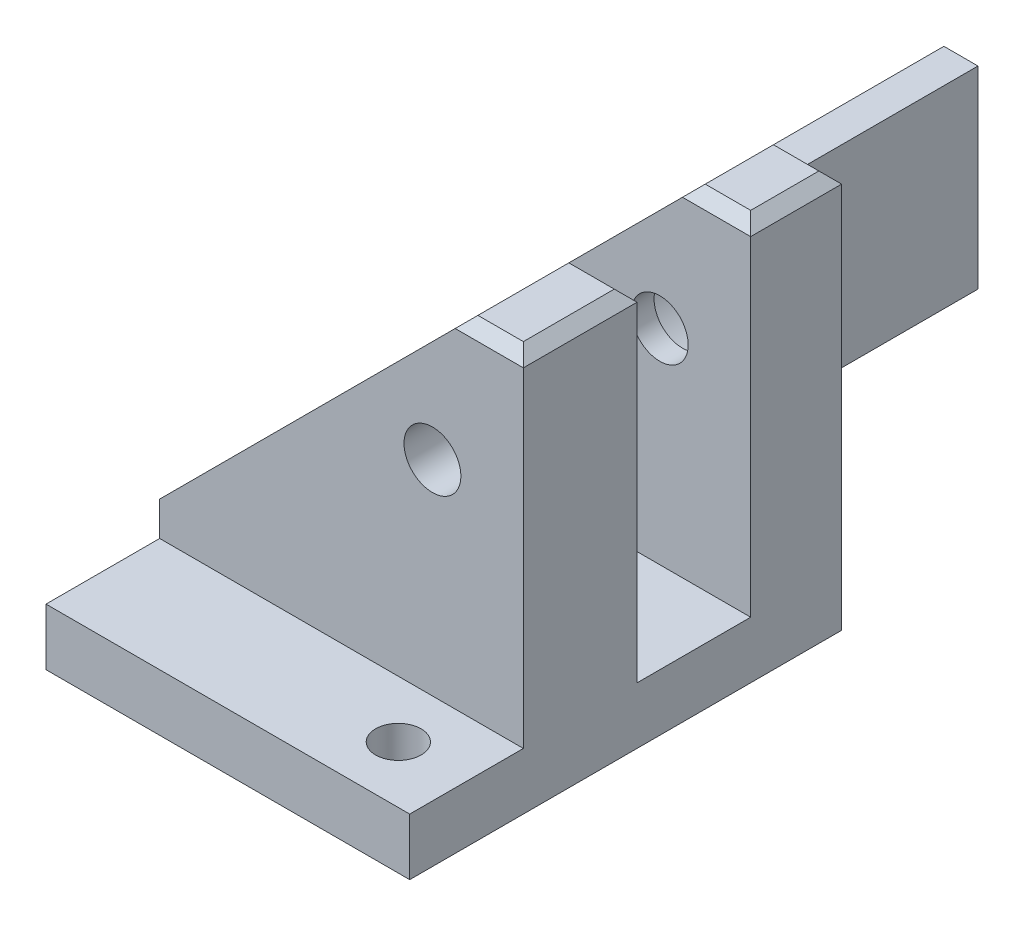
ISO-10303-21;
HEADER;
FILE_DESCRIPTION(('STEP AP214'),'2;1');
FILE_NAME('part.step','',(''),(''),'','','');
FILE_SCHEMA(('AUTOMOTIVE_DESIGN { 1 0 10303 214 1 1 1 1 }'));
ENDSEC;
DATA;
#1=APPLICATION_CONTEXT('core data for automotive mechanical design processes');
#2=APPLICATION_PROTOCOL_DEFINITION('international standard','automotive_design',2000,#1);
#3=PRODUCT_CONTEXT('',#1,'mechanical');
#4=PRODUCT('Part','Part','',(#3));
#5=PRODUCT_RELATED_PRODUCT_CATEGORY('part','',(#4));
#6=PRODUCT_DEFINITION_FORMATION('','',#4);
#7=PRODUCT_DEFINITION_CONTEXT('part definition',#1,'design');
#8=PRODUCT_DEFINITION('design','',#6,#7);
#9=PRODUCT_DEFINITION_SHAPE('','',#8);
#10=(LENGTH_UNIT() NAMED_UNIT(*) SI_UNIT(.MILLI.,.METRE.));
#11=(NAMED_UNIT(*) PLANE_ANGLE_UNIT() SI_UNIT($,.RADIAN.));
#12=(NAMED_UNIT(*) SI_UNIT($,.STERADIAN.) SOLID_ANGLE_UNIT());
#13=UNCERTAINTY_MEASURE_WITH_UNIT(LENGTH_MEASURE(1.E-05),#10,'distance_accuracy_value','');
#14=(GEOMETRIC_REPRESENTATION_CONTEXT(3) GLOBAL_UNCERTAINTY_ASSIGNED_CONTEXT((#13)) GLOBAL_UNIT_ASSIGNED_CONTEXT((#10,
#11,#12)) REPRESENTATION_CONTEXT('',''));
#15=CARTESIAN_POINT('',(0.,0.,0.));
#16=DIRECTION('',(0.,0.,1.));
#17=DIRECTION('',(1.,0.,0.));
#18=AXIS2_PLACEMENT_3D('',#15,#16,#17);
#19=CARTESIAN_POINT('',(30.0000000000003,30.,70.));
#20=DIRECTION('',(0.707106781186544,-0.707106781186551,0.));
#21=DIRECTION('',(0.707106781186551,0.707106781186544,0.));
#22=AXIS2_PLACEMENT_3D('',#19,#20,#21);
#23=PLANE('',#22);
#24=DIRECTION('',(0.,0.,1.));
#25=VECTOR('',#24,1.);
#26=CARTESIAN_POINT('',(35.0000000000003,35.,20.8196601125013));
#27=LINE('',#26,#25);
#28=CARTESIAN_POINT('',(35.0000000000003,35.,51.));
#29=VERTEX_POINT('',#28);
#30=CARTESIAN_POINT('',(35.0000000000003,35.,59.));
#31=VERTEX_POINT('',#30);
#32=EDGE_CURVE('E279',#29,#31,#27,.T.);
#33=ORIENTED_EDGE('',*,*,#32,.F.);
#34=DIRECTION('',(-0.577350269189626,-0.57735026918962,-0.577350269189632));
#35=VECTOR('',#34,1.);
#36=CARTESIAN_POINT('',(25.3333333333336,25.3333333333333,41.3333333333331));
#37=LINE('',#36,#35);
#38=CARTESIAN_POINT('',(34.0000000000004,34.,50.));
#39=VERTEX_POINT('',#38);
#40=EDGE_CURVE('E227',#29,#39,#37,.T.);
#41=ORIENTED_EDGE('',*,*,#40,.T.);
#42=DIRECTION('',(-0.707106781186551,-0.707106781186544,0.));
#43=VECTOR('',#42,1.);
#44=CARTESIAN_POINT('',(30.0000000000003,30.,50.));
#45=LINE('',#44,#43);
#46=CARTESIAN_POINT('',(8.,7.99999999999969,50.));
#47=VERTEX_POINT('',#46);
#48=EDGE_CURVE('E342',#39,#47,#45,.T.);
#49=ORIENTED_EDGE('',*,*,#48,.T.);
#50=DIRECTION('',(0.,0.,1.));
#51=VECTOR('',#50,1.);
#52=CARTESIAN_POINT('',(8.,7.99999999999969,0.));
#53=LINE('',#52,#51);
#54=CARTESIAN_POINT('',(8.,7.99999999999969,60.));
#55=VERTEX_POINT('',#54);
#56=EDGE_CURVE('E370',#47,#55,#53,.T.);
#57=ORIENTED_EDGE('',*,*,#56,.T.);
#58=DIRECTION('',(0.707106781186551,0.707106781186544,0.));
#59=VECTOR('',#58,1.);
#60=CARTESIAN_POINT('',(30.0000000000003,30.,60.));
#61=LINE('',#60,#59);
#62=CARTESIAN_POINT('',(34.0000000000003,34.,60.));
#63=VERTEX_POINT('',#62);
#64=EDGE_CURVE('E359',#55,#63,#61,.T.);
#65=ORIENTED_EDGE('',*,*,#64,.T.);
#66=DIRECTION('',(0.577350269189626,0.57735026918962,-0.577350269189632));
#67=VECTOR('',#66,1.);
#68=CARTESIAN_POINT('',(25.3333333333336,25.3333333333333,68.6666666666669));
#69=LINE('',#68,#67);
#70=EDGE_CURVE('E225',#63,#31,#69,.T.);
#71=ORIENTED_EDGE('',*,*,#70,.T.);
#72=EDGE_LOOP('',(#33,#41,#49,#57,#65,#71));
#73=FACE_BOUND('',#72,.T.);
#74=ADVANCED_FACE('F32',(#73),#23,.F.);
#75=CARTESIAN_POINT('',(35.0000000000003,35.,20.8196601125013));
#76=DIRECTION('',(0.,1.,0.));
#77=DIRECTION('',(0.,0.,1.));
#78=AXIS2_PLACEMENT_3D('',#75,#76,#77);
#79=PLANE('',#78);
#80=DIRECTION('',(1.,0.,0.));
#81=VECTOR('',#80,1.);
#82=CARTESIAN_POINT('',(40.,35.,59.));
#83=LINE('',#82,#81);
#84=CARTESIAN_POINT('',(39.,35.,59.));
#85=VERTEX_POINT('',#84);
#86=EDGE_CURVE('E221',#31,#85,#83,.T.);
#87=ORIENTED_EDGE('',*,*,#86,.T.);
#88=DIRECTION('',(0.,0.,-1.));
#89=VECTOR('',#88,1.);
#90=CARTESIAN_POINT('',(39.,35.,51.));
#91=LINE('',#90,#89);
#92=CARTESIAN_POINT('',(39.,35.,51.));
#93=VERTEX_POINT('',#92);
#94=EDGE_CURVE('E41',#85,#93,#91,.T.);
#95=ORIENTED_EDGE('',*,*,#94,.T.);
#96=DIRECTION('',(-1.,0.,0.));
#97=VECTOR('',#96,1.);
#98=CARTESIAN_POINT('',(35.0000000000003,35.,51.));
#99=LINE('',#98,#97);
#100=EDGE_CURVE('E223',#93,#29,#99,.T.);
#101=ORIENTED_EDGE('',*,*,#100,.T.);
#102=ORIENTED_EDGE('',*,*,#32,.T.);
#103=EDGE_LOOP('',(#87,#95,#101,#102));
#104=FACE_BOUND('',#103,.T.);
#105=ADVANCED_FACE('F413',(#104),#79,.T.);
#106=CARTESIAN_POINT('',(35.,30.,32.));
#107=DIRECTION('',(0.,0.,1.));
#108=DIRECTION('',(1.,0.,0.));
#109=AXIS2_PLACEMENT_3D('',#106,#107,#108);
#110=PLANE('',#109);
#111=CARTESIAN_POINT('',(32.,23.,32.));
#112=DIRECTION('',(0.,0.,-1.));
#113=DIRECTION('',(-1.,0.,0.));
#114=AXIS2_PLACEMENT_3D('',#111,#112,#113);
#115=CIRCLE('',#114,6.29999999999999);
#116=CARTESIAN_POINT('',(25.7,23.,32.));
#117=VERTEX_POINT('',#116);
#118=EDGE_CURVE('E314',#117,#117,#115,.T.);
#119=ORIENTED_EDGE('',*,*,#118,.F.);
#120=EDGE_LOOP('',(#119));
#121=FACE_BOUND('',#120,.T.);
#122=DIRECTION('',(-0.707106781186551,-0.707106781186544,0.));
#123=VECTOR('',#122,1.);
#124=CARTESIAN_POINT('',(30.0000000000003,30.,32.));
#125=LINE('',#124,#123);
#126=CARTESIAN_POINT('',(34.0000000000004,34.,32.));
#127=VERTEX_POINT('',#126);
#128=CARTESIAN_POINT('',(17.0000000000001,16.9999999999998,32.));
#129=VERTEX_POINT('',#128);
#130=EDGE_CURVE('E260',#127,#129,#125,.T.);
#131=ORIENTED_EDGE('',*,*,#130,.F.);
#132=DIRECTION('',(1.,0.,0.));
#133=VECTOR('',#132,1.);
#134=CARTESIAN_POINT('',(40.,34.,32.));
#135=LINE('',#134,#133);
#136=CARTESIAN_POINT('',(40.,34.,32.));
#137=VERTEX_POINT('',#136);
#138=EDGE_CURVE('E203',#127,#137,#135,.T.);
#139=ORIENTED_EDGE('',*,*,#138,.T.);
#140=DIRECTION('',(0.,1.,0.));
#141=VECTOR('',#140,1.);
#142=CARTESIAN_POINT('',(40.,30.,32.));
#143=LINE('',#142,#141);
#144=CARTESIAN_POINT('',(40.,0.,32.));
#145=VERTEX_POINT('',#144);
#146=EDGE_CURVE('E258',#145,#137,#143,.T.);
#147=ORIENTED_EDGE('',*,*,#146,.F.);
#148=DIRECTION('',(1.,0.,0.));
#149=VECTOR('',#148,1.);
#150=CARTESIAN_POINT('',(40.,0.,32.));
#151=LINE('',#150,#149);
#152=CARTESIAN_POINT('',(20.,0.,32.));
#153=VERTEX_POINT('',#152);
#154=EDGE_CURVE('E184',#153,#145,#151,.T.);
#155=ORIENTED_EDGE('',*,*,#154,.F.);
#156=DIRECTION('',(0.,-1.,0.));
#157=VECTOR('',#156,1.);
#158=CARTESIAN_POINT('',(20.,25.,32.));
#159=LINE('',#158,#157);
#160=CARTESIAN_POINT('',(20.,16.9999999999998,32.));
#161=VERTEX_POINT('',#160);
#162=EDGE_CURVE('E174',#161,#153,#159,.T.);
#163=ORIENTED_EDGE('',*,*,#162,.F.);
#164=DIRECTION('',(-1.,0.,0.));
#165=VECTOR('',#164,1.);
#166=CARTESIAN_POINT('',(20.,16.9999999999998,32.));
#167=LINE('',#166,#165);
#168=EDGE_CURVE('E286',#161,#129,#167,.T.);
#169=ORIENTED_EDGE('',*,*,#168,.T.);
#170=EDGE_LOOP('',(#131,#139,#147,#155,#163,#169));
#171=FACE_BOUND('',#170,.T.);
#172=ADVANCED_FACE('F257',(#121,#171),#110,.F.);
#173=CARTESIAN_POINT('',(14.,13.9999999999999,10.));
#174=DIRECTION('',(0.707106781186544,-0.707106781186551,0.));
#175=DIRECTION('',(-0.707106781186551,-0.707106781186544,0.));
#176=AXIS2_PLACEMENT_3D('',#173,#174,#175);
#177=ELLIPSE('',#176,2.82842712474619,2.00000000000001);
#178=CARTESIAN_POINT('',(12.,11.9999999999999,10.));
#179=VERTEX_POINT('',#178);
#180=EDGE_CURVE('E36',#179,#179,#177,.T.);
#181=ORIENTED_EDGE('',*,*,#180,.T.);
#182=EDGE_LOOP('',(#181));
#183=FACE_BOUND('',#182,.T.);
#184=CARTESIAN_POINT('',(35.0000000000003,35.,33.));
#185=VERTEX_POINT('',#184);
#186=CARTESIAN_POINT('',(35.0000000000003,35.,39.));
#187=VERTEX_POINT('',#186);
#188=EDGE_CURVE('E185',#185,#187,#27,.T.);
#189=ORIENTED_EDGE('',*,*,#188,.F.);
#190=DIRECTION('',(-0.577350269189627,-0.577350269189621,-0.577350269189629));
#191=VECTOR('',#190,1.);
#192=CARTESIAN_POINT('',(34.3333333333336,34.3333333333332,32.3333333333332));
#193=LINE('',#192,#191);
#194=EDGE_CURVE('E213',#185,#127,#193,.T.);
#195=ORIENTED_EDGE('',*,*,#194,.T.);
#196=ORIENTED_EDGE('',*,*,#130,.T.);
#197=DIRECTION('',(0.,0.,-1.));
#198=VECTOR('',#197,1.);
#199=CARTESIAN_POINT('',(17.0000000000001,16.9999999999998,36.2426406871192));
#200=LINE('',#199,#198);
#201=CARTESIAN_POINT('',(17.0000000000001,16.9999999999998,0.));
#202=VERTEX_POINT('',#201);
#203=EDGE_CURVE('E288',#129,#202,#200,.T.);
#204=ORIENTED_EDGE('',*,*,#203,.T.);
#205=DIRECTION('',(0.707106781186544,0.707106781186551,0.));
#206=VECTOR('',#205,1.);
#207=CARTESIAN_POINT('',(20.,19.9999999999998,0.));
#208=LINE('',#207,#206);
#209=CARTESIAN_POINT('',(8.,7.99999999999969,0.));
#210=VERTEX_POINT('',#209);
#211=EDGE_CURVE('E175',#210,#202,#208,.T.);
#212=ORIENTED_EDGE('',*,*,#211,.F.);
#213=CARTESIAN_POINT('',(8.,7.99999999999968,40.));
#214=VERTEX_POINT('',#213);
#215=EDGE_CURVE('E368',#210,#214,#53,.T.);
#216=ORIENTED_EDGE('',*,*,#215,.T.);
#217=DIRECTION('',(0.707106781186551,0.707106781186544,0.));
#218=VECTOR('',#217,1.);
#219=CARTESIAN_POINT('',(30.0000000000003,30.,40.));
#220=LINE('',#219,#218);
#221=CARTESIAN_POINT('',(34.0000000000004,34.,40.));
#222=VERTEX_POINT('',#221);
#223=EDGE_CURVE('E337',#214,#222,#220,.T.);
#224=ORIENTED_EDGE('',*,*,#223,.T.);
#225=DIRECTION('',(0.577350269189626,0.57735026918962,-0.577350269189632));
#226=VECTOR('',#225,1.);
#227=CARTESIAN_POINT('',(25.3333333333336,25.3333333333333,48.6666666666669));
#228=LINE('',#227,#226);
#229=EDGE_CURVE('E211',#222,#187,#228,.T.);
#230=ORIENTED_EDGE('',*,*,#229,.T.);
#231=EDGE_LOOP('',(#189,#195,#196,#204,#212,#216,#224,#230));
#232=FACE_BOUND('',#231,.T.);
#233=ADVANCED_FACE('F34',(#183,#232),#23,.F.);
#234=CARTESIAN_POINT('',(0.,0.,70.));
#235=DIRECTION('',(0.,1.,0.));
#236=DIRECTION('',(0.,0.,1.));
#237=AXIS2_PLACEMENT_3D('',#234,#235,#236);
#238=PLANE('',#237);
#239=CARTESIAN_POINT('',(34.,0.,65.));
#240=DIRECTION('',(0.,-1.,0.));
#241=DIRECTION('',(0.,0.,-1.));
#242=AXIS2_PLACEMENT_3D('',#239,#240,#241);
#243=CIRCLE('',#242,2.);
#244=CARTESIAN_POINT('',(34.,0.,63.));
#245=VERTEX_POINT('',#244);
#246=EDGE_CURVE('E267',#245,#245,#243,.T.);
#247=ORIENTED_EDGE('',*,*,#246,.F.);
#248=EDGE_LOOP('',(#247));
#249=FACE_BOUND('',#248,.T.);
#250=CARTESIAN_POINT('',(14.,0.,10.));
#251=DIRECTION('',(0.,-1.,0.));
#252=DIRECTION('',(0.,0.,-1.));
#253=AXIS2_PLACEMENT_3D('',#250,#251,#252);
#254=CIRCLE('',#253,2.00000000000001);
#255=CARTESIAN_POINT('',(14.,0.,8.));
#256=VERTEX_POINT('',#255);
#257=EDGE_CURVE('E299',#256,#256,#254,.T.);
#258=ORIENTED_EDGE('',*,*,#257,.F.);
#259=EDGE_LOOP('',(#258));
#260=FACE_BOUND('',#259,.T.);
#261=DIRECTION('',(0.,0.,1.));
#262=VECTOR('',#261,1.);
#263=CARTESIAN_POINT('',(20.,0.,32.));
#264=LINE('',#263,#262);
#265=CARTESIAN_POINT('',(20.,0.,0.));
#266=VERTEX_POINT('',#265);
#267=EDGE_CURVE('E178',#266,#153,#264,.T.);
#268=ORIENTED_EDGE('',*,*,#267,.T.);
#269=ORIENTED_EDGE('',*,*,#154,.T.);
#270=DIRECTION('',(0.,0.,1.));
#271=VECTOR('',#270,1.);
#272=CARTESIAN_POINT('',(40.,0.,0.));
#273=LINE('',#272,#271);
#274=CARTESIAN_POINT('',(40.,0.,70.));
#275=VERTEX_POINT('',#274);
#276=EDGE_CURVE('E192',#145,#275,#273,.T.);
#277=ORIENTED_EDGE('',*,*,#276,.T.);
#278=DIRECTION('',(1.,0.,0.));
#279=VECTOR('',#278,1.);
#280=CARTESIAN_POINT('',(0.,0.,70.));
#281=LINE('',#280,#279);
#282=CARTESIAN_POINT('',(8.,0.,70.));
#283=VERTEX_POINT('',#282);
#284=EDGE_CURVE('E191',#283,#275,#281,.T.);
#285=ORIENTED_EDGE('',*,*,#284,.F.);
#286=DIRECTION('',(0.,0.,1.));
#287=VECTOR('',#286,1.);
#288=CARTESIAN_POINT('',(8.,0.,0.));
#289=LINE('',#288,#287);
#290=CARTESIAN_POINT('',(8.,0.,0.));
#291=VERTEX_POINT('',#290);
#292=EDGE_CURVE('E190',#291,#283,#289,.T.);
#293=ORIENTED_EDGE('',*,*,#292,.F.);
#294=DIRECTION('',(1.,0.,0.));
#295=VECTOR('',#294,1.);
#296=CARTESIAN_POINT('',(0.,0.,0.));
#297=LINE('',#296,#295);
#298=EDGE_CURVE('E169',#291,#266,#297,.T.);
#299=ORIENTED_EDGE('',*,*,#298,.T.);
#300=EDGE_LOOP('',(#268,#269,#277,#285,#293,#299));
#301=FACE_BOUND('',#300,.T.);
#302=ADVANCED_FACE('F188',(#249,#260,#301),#238,.F.);
#303=CARTESIAN_POINT('',(50.,49.9999999999995,70.));
#304=DIRECTION('',(0.,0.,-1.));
#305=DIRECTION('',(-1.,0.,0.));
#306=AXIS2_PLACEMENT_3D('',#303,#304,#305);
#307=PLANE('',#306);
#308=DIRECTION('',(0.,-1.,0.));
#309=VECTOR('',#308,1.);
#310=CARTESIAN_POINT('',(40.,30.,70.));
#311=LINE('',#310,#309);
#312=CARTESIAN_POINT('',(40.,5.,70.));
#313=VERTEX_POINT('',#312);
#314=EDGE_CURVE('E197',#313,#275,#311,.T.);
#315=ORIENTED_EDGE('',*,*,#314,.F.);
#316=DIRECTION('',(1.,0.,0.));
#317=VECTOR('',#316,1.);
#318=CARTESIAN_POINT('',(8.,5.,70.));
#319=LINE('',#318,#317);
#320=CARTESIAN_POINT('',(8.,5.,70.));
#321=VERTEX_POINT('',#320);
#322=EDGE_CURVE('E356',#321,#313,#319,.T.);
#323=ORIENTED_EDGE('',*,*,#322,.F.);
#324=DIRECTION('',(0.,1.,0.));
#325=VECTOR('',#324,1.);
#326=CARTESIAN_POINT('',(8.,7.99999999999969,70.));
#327=LINE('',#326,#325);
#328=EDGE_CURVE('E363',#283,#321,#327,.T.);
#329=ORIENTED_EDGE('',*,*,#328,.F.);
#330=ORIENTED_EDGE('',*,*,#284,.T.);
#331=EDGE_LOOP('',(#315,#323,#329,#330));
#332=FACE_BOUND('',#331,.T.);
#333=ADVANCED_FACE('F377',(#332),#307,.F.);
#334=CARTESIAN_POINT('',(50.,49.9999999999995,0.));
#335=DIRECTION('',(0.,0.,-1.));
#336=DIRECTION('',(-1.,0.,0.));
#337=AXIS2_PLACEMENT_3D('',#334,#335,#336);
#338=PLANE('',#337);
#339=DIRECTION('',(0.,-1.,0.));
#340=VECTOR('',#339,1.);
#341=CARTESIAN_POINT('',(20.,25.,0.));
#342=LINE('',#341,#340);
#343=CARTESIAN_POINT('',(20.,16.9999999999998,0.));
#344=VERTEX_POINT('',#343);
#345=EDGE_CURVE('E164',#344,#266,#342,.T.);
#346=ORIENTED_EDGE('',*,*,#345,.T.);
#347=ORIENTED_EDGE('',*,*,#298,.F.);
#348=DIRECTION('',(0.,1.,0.));
#349=VECTOR('',#348,1.);
#350=CARTESIAN_POINT('',(8.,7.99999999999969,0.));
#351=LINE('',#350,#349);
#352=EDGE_CURVE('E366',#291,#210,#351,.T.);
#353=ORIENTED_EDGE('',*,*,#352,.T.);
#354=ORIENTED_EDGE('',*,*,#211,.T.);
#355=DIRECTION('',(-1.,0.,0.));
#356=VECTOR('',#355,1.);
#357=CARTESIAN_POINT('',(20.,16.9999999999998,0.));
#358=LINE('',#357,#356);
#359=EDGE_CURVE('E171',#344,#202,#358,.T.);
#360=ORIENTED_EDGE('',*,*,#359,.F.);
#361=EDGE_LOOP('',(#346,#347,#353,#354,#360));
#362=FACE_BOUND('',#361,.T.);
#363=ADVANCED_FACE('F166',(#362),#338,.T.);
#364=CARTESIAN_POINT('',(40.,30.,0.));
#365=DIRECTION('',(-1.,0.,0.));
#366=DIRECTION('',(0.,0.,1.));
#367=AXIS2_PLACEMENT_3D('',#364,#365,#366);
#368=PLANE('',#367);
#369=ORIENTED_EDGE('',*,*,#146,.T.);
#370=DIRECTION('',(0.,0.,1.));
#371=VECTOR('',#370,1.);
#372=CARTESIAN_POINT('',(40.,34.,39.));
#373=LINE('',#372,#371);
#374=CARTESIAN_POINT('',(40.,34.,40.));
#375=VERTEX_POINT('',#374);
#376=EDGE_CURVE('E235',#137,#375,#373,.T.);
#377=ORIENTED_EDGE('',*,*,#376,.T.);
#378=DIRECTION('',(0.,1.,0.));
#379=VECTOR('',#378,1.);
#380=CARTESIAN_POINT('',(40.,30.,40.));
#381=LINE('',#380,#379);
#382=CARTESIAN_POINT('',(40.,5.,40.));
#383=VERTEX_POINT('',#382);
#384=EDGE_CURVE('E326',#383,#375,#381,.T.);
#385=ORIENTED_EDGE('',*,*,#384,.F.);
#386=DIRECTION('',(0.,0.,-1.));
#387=VECTOR('',#386,1.);
#388=CARTESIAN_POINT('',(40.,5.,50.));
#389=LINE('',#388,#387);
#390=CARTESIAN_POINT('',(40.,5.,50.));
#391=VERTEX_POINT('',#390);
#392=EDGE_CURVE('E323',#391,#383,#389,.T.);
#393=ORIENTED_EDGE('',*,*,#392,.F.);
#394=DIRECTION('',(0.,-1.,0.));
#395=VECTOR('',#394,1.);
#396=CARTESIAN_POINT('',(40.,30.,50.));
#397=LINE('',#396,#395);
#398=CARTESIAN_POINT('',(40.,34.,50.));
#399=VERTEX_POINT('',#398);
#400=EDGE_CURVE('E321',#399,#391,#397,.T.);
#401=ORIENTED_EDGE('',*,*,#400,.F.);
#402=DIRECTION('',(0.,0.,1.));
#403=VECTOR('',#402,1.);
#404=CARTESIAN_POINT('',(40.,34.,59.));
#405=LINE('',#404,#403);
#406=CARTESIAN_POINT('',(40.,34.,60.));
#407=VERTEX_POINT('',#406);
#408=EDGE_CURVE('E232',#399,#407,#405,.T.);
#409=ORIENTED_EDGE('',*,*,#408,.T.);
#410=DIRECTION('',(0.,1.,0.));
#411=VECTOR('',#410,1.);
#412=CARTESIAN_POINT('',(40.,30.,60.));
#413=LINE('',#412,#411);
#414=CARTESIAN_POINT('',(40.,5.,60.));
#415=VERTEX_POINT('',#414);
#416=EDGE_CURVE('E347',#415,#407,#413,.T.);
#417=ORIENTED_EDGE('',*,*,#416,.F.);
#418=DIRECTION('',(0.,0.,-1.));
#419=VECTOR('',#418,1.);
#420=CARTESIAN_POINT('',(40.,5.,70.));
#421=LINE('',#420,#419);
#422=EDGE_CURVE('E344',#313,#415,#421,.T.);
#423=ORIENTED_EDGE('',*,*,#422,.F.);
#424=ORIENTED_EDGE('',*,*,#314,.T.);
#425=ORIENTED_EDGE('',*,*,#276,.F.);
#426=EDGE_LOOP('',(#369,#377,#385,#393,#401,#409,#417,#423,#424,#425));
#427=FACE_BOUND('',#426,.T.);
#428=ADVANCED_FACE('F263',(#427),#368,.F.);
#429=CARTESIAN_POINT('',(8.,7.99999999999969,0.));
#430=DIRECTION('',(1.,0.,0.));
#431=DIRECTION('',(0.,1.,0.));
#432=AXIS2_PLACEMENT_3D('',#429,#430,#431);
#433=PLANE('',#432);
#434=ORIENTED_EDGE('',*,*,#215,.F.);
#435=ORIENTED_EDGE('',*,*,#352,.F.);
#436=ORIENTED_EDGE('',*,*,#292,.T.);
#437=ORIENTED_EDGE('',*,*,#328,.T.);
#438=DIRECTION('',(0.,0.,-1.));
#439=VECTOR('',#438,1.);
#440=CARTESIAN_POINT('',(8.,5.,70.));
#441=LINE('',#440,#439);
#442=CARTESIAN_POINT('',(8.,5.,60.));
#443=VERTEX_POINT('',#442);
#444=EDGE_CURVE('E350',#321,#443,#441,.T.);
#445=ORIENTED_EDGE('',*,*,#444,.T.);
#446=DIRECTION('',(0.,1.,0.));
#447=VECTOR('',#446,1.);
#448=CARTESIAN_POINT('',(8.,30.,60.));
#449=LINE('',#448,#447);
#450=EDGE_CURVE('E353',#443,#55,#449,.T.);
#451=ORIENTED_EDGE('',*,*,#450,.T.);
#452=ORIENTED_EDGE('',*,*,#56,.F.);
#453=DIRECTION('',(0.,-1.,0.));
#454=VECTOR('',#453,1.);
#455=CARTESIAN_POINT('',(8.,7.99999999999969,50.));
#456=LINE('',#455,#454);
#457=CARTESIAN_POINT('',(8.,5.,50.));
#458=VERTEX_POINT('',#457);
#459=EDGE_CURVE('E195',#47,#458,#456,.T.);
#460=ORIENTED_EDGE('',*,*,#459,.T.);
#461=DIRECTION('',(0.,0.,-1.));
#462=VECTOR('',#461,1.);
#463=CARTESIAN_POINT('',(8.,5.,50.));
#464=LINE('',#463,#462);
#465=CARTESIAN_POINT('',(8.,5.,40.));
#466=VERTEX_POINT('',#465);
#467=EDGE_CURVE('E328',#458,#466,#464,.T.);
#468=ORIENTED_EDGE('',*,*,#467,.T.);
#469=DIRECTION('',(0.,1.,0.));
#470=VECTOR('',#469,1.);
#471=CARTESIAN_POINT('',(8.,30.,40.));
#472=LINE('',#471,#470);
#473=EDGE_CURVE('E331',#466,#214,#472,.T.);
#474=ORIENTED_EDGE('',*,*,#473,.T.);
#475=EDGE_LOOP('',(#434,#435,#436,#437,#445,#451,#452,#460,#468,#474));
#476=FACE_BOUND('',#475,.T.);
#477=ADVANCED_FACE('F383',(#476),#433,.F.);
#478=CARTESIAN_POINT('',(8.,30.,60.));
#479=DIRECTION('',(0.,0.,-1.));
#480=DIRECTION('',(-1.,0.,0.));
#481=AXIS2_PLACEMENT_3D('',#478,#479,#480);
#482=PLANE('',#481);
#483=CARTESIAN_POINT('',(32.,23.,60.));
#484=DIRECTION('',(0.,0.,-1.));
#485=DIRECTION('',(-1.,0.,0.));
#486=AXIS2_PLACEMENT_3D('',#483,#484,#485);
#487=CIRCLE('',#486,2.5);
#488=CARTESIAN_POINT('',(29.5,23.,60.));
#489=VERTEX_POINT('',#488);
#490=EDGE_CURVE('E311',#489,#489,#487,.T.);
#491=ORIENTED_EDGE('',*,*,#490,.T.);
#492=EDGE_LOOP('',(#491));
#493=FACE_BOUND('',#492,.T.);
#494=ORIENTED_EDGE('',*,*,#416,.T.);
#495=DIRECTION('',(-1.,0.,0.));
#496=VECTOR('',#495,1.);
#497=CARTESIAN_POINT('',(35.0000000000003,34.,60.));
#498=LINE('',#497,#496);
#499=EDGE_CURVE('E229',#407,#63,#498,.T.);
#500=ORIENTED_EDGE('',*,*,#499,.T.);
#501=ORIENTED_EDGE('',*,*,#64,.F.);
#502=ORIENTED_EDGE('',*,*,#450,.F.);
#503=DIRECTION('',(1.,0.,0.));
#504=VECTOR('',#503,1.);
#505=CARTESIAN_POINT('',(8.,5.,60.));
#506=LINE('',#505,#504);
#507=EDGE_CURVE('E357',#443,#415,#506,.T.);
#508=ORIENTED_EDGE('',*,*,#507,.T.);
#509=EDGE_LOOP('',(#494,#500,#501,#502,#508));
#510=FACE_BOUND('',#509,.T.);
#511=ADVANCED_FACE('F407',(#493,#510),#482,.F.);
#512=CARTESIAN_POINT('',(8.,5.,70.));
#513=DIRECTION('',(0.,-1.,0.));
#514=DIRECTION('',(0.,0.,-1.));
#515=AXIS2_PLACEMENT_3D('',#512,#513,#514);
#516=PLANE('',#515);
#517=CARTESIAN_POINT('',(34.,5.,65.));
#518=DIRECTION('',(0.,-1.,0.));
#519=DIRECTION('',(0.,0.,-1.));
#520=AXIS2_PLACEMENT_3D('',#517,#518,#519);
#521=CIRCLE('',#520,2.);
#522=CARTESIAN_POINT('',(34.,5.,63.));
#523=VERTEX_POINT('',#522);
#524=EDGE_CURVE('E296',#523,#523,#521,.F.);
#525=ORIENTED_EDGE('',*,*,#524,.F.);
#526=EDGE_LOOP('',(#525));
#527=FACE_BOUND('',#526,.T.);
#528=ORIENTED_EDGE('',*,*,#422,.T.);
#529=ORIENTED_EDGE('',*,*,#507,.F.);
#530=ORIENTED_EDGE('',*,*,#444,.F.);
#531=ORIENTED_EDGE('',*,*,#322,.T.);
#532=EDGE_LOOP('',(#528,#529,#530,#531));
#533=FACE_BOUND('',#532,.T.);
#534=ADVANCED_FACE('F462',(#527,#533),#516,.F.);
#535=CARTESIAN_POINT('',(8.,30.,50.));
#536=DIRECTION('',(0.,0.,1.));
#537=DIRECTION('',(1.,0.,0.));
#538=AXIS2_PLACEMENT_3D('',#535,#536,#537);
#539=PLANE('',#538);
#540=CARTESIAN_POINT('',(32.,23.,50.));
#541=DIRECTION('',(0.,0.,1.));
#542=DIRECTION('',(1.,0.,0.));
#543=AXIS2_PLACEMENT_3D('',#540,#541,#542);
#544=CIRCLE('',#543,2.5);
#545=CARTESIAN_POINT('',(34.5,23.,50.));
#546=VERTEX_POINT('',#545);
#547=EDGE_CURVE('E308',#546,#546,#544,.T.);
#548=ORIENTED_EDGE('',*,*,#547,.T.);
#549=EDGE_LOOP('',(#548));
#550=FACE_BOUND('',#549,.T.);
#551=ORIENTED_EDGE('',*,*,#48,.F.);
#552=DIRECTION('',(1.,0.,0.));
#553=VECTOR('',#552,1.);
#554=CARTESIAN_POINT('',(40.,34.,50.));
#555=LINE('',#554,#553);
#556=EDGE_CURVE('E218',#39,#399,#555,.T.);
#557=ORIENTED_EDGE('',*,*,#556,.T.);
#558=ORIENTED_EDGE('',*,*,#400,.T.);
#559=DIRECTION('',(1.,0.,0.));
#560=VECTOR('',#559,1.);
#561=CARTESIAN_POINT('',(8.,5.,50.));
#562=LINE('',#561,#560);
#563=EDGE_CURVE('E334',#458,#391,#562,.T.);
#564=ORIENTED_EDGE('',*,*,#563,.F.);
#565=ORIENTED_EDGE('',*,*,#459,.F.);
#566=EDGE_LOOP('',(#551,#557,#558,#564,#565));
#567=FACE_BOUND('',#566,.T.);
#568=ADVANCED_FACE('F397',(#550,#567),#539,.F.);
#569=CARTESIAN_POINT('',(8.,30.,40.));
#570=DIRECTION('',(0.,0.,-1.));
#571=DIRECTION('',(-1.,0.,0.));
#572=AXIS2_PLACEMENT_3D('',#569,#570,#571);
#573=PLANE('',#572);
#574=CARTESIAN_POINT('',(32.,23.,40.));
#575=DIRECTION('',(0.,0.,-1.));
#576=DIRECTION('',(-1.,0.,0.));
#577=AXIS2_PLACEMENT_3D('',#574,#575,#576);
#578=CIRCLE('',#577,2.5);
#579=CARTESIAN_POINT('',(29.5,23.,40.));
#580=VERTEX_POINT('',#579);
#581=EDGE_CURVE('E305',#580,#580,#578,.T.);
#582=ORIENTED_EDGE('',*,*,#581,.T.);
#583=EDGE_LOOP('',(#582));
#584=FACE_BOUND('',#583,.T.);
#585=ORIENTED_EDGE('',*,*,#384,.T.);
#586=DIRECTION('',(-1.,0.,0.));
#587=VECTOR('',#586,1.);
#588=CARTESIAN_POINT('',(35.0000000000003,34.,40.));
#589=LINE('',#588,#587);
#590=EDGE_CURVE('E215',#375,#222,#589,.T.);
#591=ORIENTED_EDGE('',*,*,#590,.T.);
#592=ORIENTED_EDGE('',*,*,#223,.F.);
#593=ORIENTED_EDGE('',*,*,#473,.F.);
#594=DIRECTION('',(1.,0.,0.));
#595=VECTOR('',#594,1.);
#596=CARTESIAN_POINT('',(8.,5.,40.));
#597=LINE('',#596,#595);
#598=EDGE_CURVE('E335',#466,#383,#597,.T.);
#599=ORIENTED_EDGE('',*,*,#598,.T.);
#600=EDGE_LOOP('',(#585,#591,#592,#593,#599));
#601=FACE_BOUND('',#600,.T.);
#602=ADVANCED_FACE('F386',(#584,#601),#573,.F.);
#603=CARTESIAN_POINT('',(8.,5.,50.));
#604=DIRECTION('',(0.,-1.,0.));
#605=DIRECTION('',(0.,0.,-1.));
#606=AXIS2_PLACEMENT_3D('',#603,#604,#605);
#607=PLANE('',#606);
#608=ORIENTED_EDGE('',*,*,#392,.T.);
#609=ORIENTED_EDGE('',*,*,#598,.F.);
#610=ORIENTED_EDGE('',*,*,#467,.F.);
#611=ORIENTED_EDGE('',*,*,#563,.T.);
#612=EDGE_LOOP('',(#608,#609,#610,#611));
#613=FACE_BOUND('',#612,.T.);
#614=ADVANCED_FACE('F392',(#613),#607,.F.);
#615=CARTESIAN_POINT('',(32.,23.,38.));
#616=DIRECTION('',(0.,0.,-1.));
#617=DIRECTION('',(-1.,0.,0.));
#618=AXIS2_PLACEMENT_3D('',#615,#616,#617);
#619=CYLINDRICAL_SURFACE('',#618,6.29999999999999);
#620=CARTESIAN_POINT('',(32.,23.,38.));
#621=DIRECTION('',(0.,0.,-1.));
#622=DIRECTION('',(-1.,0.,0.));
#623=AXIS2_PLACEMENT_3D('',#620,#621,#622);
#624=CIRCLE('',#623,6.29999999999999);
#625=CARTESIAN_POINT('',(25.7,23.,38.));
#626=VERTEX_POINT('',#625);
#627=EDGE_CURVE('E317',#626,#626,#624,.T.);
#628=ORIENTED_EDGE('',*,*,#627,.F.);
#629=EDGE_LOOP('',(#628));
#630=FACE_BOUND('',#629,.T.);
#631=ORIENTED_EDGE('',*,*,#118,.T.);
#632=EDGE_LOOP('',(#631));
#633=FACE_BOUND('',#632,.T.);
#634=ADVANCED_FACE('F450',(#630,#633),#619,.F.);
#635=CARTESIAN_POINT('',(32.,23.,38.));
#636=DIRECTION('',(0.,0.,-1.));
#637=DIRECTION('',(-1.,0.,0.));
#638=AXIS2_PLACEMENT_3D('',#635,#636,#637);
#639=PLANE('',#638);
#640=CARTESIAN_POINT('',(32.,23.,38.));
#641=DIRECTION('',(0.,0.,-1.));
#642=DIRECTION('',(-1.,0.,0.));
#643=AXIS2_PLACEMENT_3D('',#640,#641,#642);
#644=CIRCLE('',#643,2.5);
#645=CARTESIAN_POINT('',(29.5,23.,38.));
#646=VERTEX_POINT('',#645);
#647=EDGE_CURVE('E302',#646,#646,#644,.T.);
#648=ORIENTED_EDGE('',*,*,#647,.F.);
#649=EDGE_LOOP('',(#648));
#650=FACE_BOUND('',#649,.T.);
#651=ORIENTED_EDGE('',*,*,#627,.T.);
#652=EDGE_LOOP('',(#651));
#653=FACE_BOUND('',#652,.T.);
#654=ADVANCED_FACE('F447',(#650,#653),#639,.T.);
#655=CARTESIAN_POINT('',(32.,23.,70.));
#656=DIRECTION('',(0.,0.,-1.));
#657=DIRECTION('',(-1.,0.,0.));
#658=AXIS2_PLACEMENT_3D('',#655,#656,#657);
#659=CYLINDRICAL_SURFACE('',#658,2.5);
#660=ORIENTED_EDGE('',*,*,#647,.T.);
#661=EDGE_LOOP('',(#660));
#662=FACE_BOUND('',#661,.T.);
#663=ORIENTED_EDGE('',*,*,#581,.F.);
#664=EDGE_LOOP('',(#663));
#665=FACE_BOUND('',#664,.T.);
#666=ADVANCED_FACE('F445',(#662,#665),#659,.F.);
#667=ORIENTED_EDGE('',*,*,#547,.F.);
#668=EDGE_LOOP('',(#667));
#669=FACE_BOUND('',#668,.T.);
#670=ORIENTED_EDGE('',*,*,#490,.F.);
#671=EDGE_LOOP('',(#670));
#672=FACE_BOUND('',#671,.T.);
#673=ADVANCED_FACE('F441',(#669,#672),#659,.F.);
#674=CARTESIAN_POINT('',(14.,30.,10.));
#675=DIRECTION('',(0.,-1.,0.));
#676=DIRECTION('',(0.,0.,-1.));
#677=AXIS2_PLACEMENT_3D('',#674,#675,#676);
#678=CYLINDRICAL_SURFACE('',#677,2.00000000000001);
#679=ORIENTED_EDGE('',*,*,#257,.T.);
#680=EDGE_LOOP('',(#679));
#681=FACE_BOUND('',#680,.T.);
#682=ORIENTED_EDGE('',*,*,#180,.F.);
#683=EDGE_LOOP('',(#682));
#684=FACE_BOUND('',#683,.T.);
#685=ADVANCED_FACE('F437',(#681,#684),#678,.F.);
#686=CARTESIAN_POINT('',(34.,30.001,65.));
#687=DIRECTION('',(0.,-1.,0.));
#688=DIRECTION('',(0.,0.,-1.));
#689=AXIS2_PLACEMENT_3D('',#686,#687,#688);
#690=CYLINDRICAL_SURFACE('',#689,2.);
#691=ORIENTED_EDGE('',*,*,#246,.T.);
#692=EDGE_LOOP('',(#691));
#693=FACE_BOUND('',#692,.T.);
#694=ORIENTED_EDGE('',*,*,#524,.T.);
#695=EDGE_LOOP('',(#694));
#696=FACE_BOUND('',#695,.T.);
#697=ADVANCED_FACE('F432',(#693,#696),#690,.F.);
#698=CARTESIAN_POINT('',(20.,25.,32.));
#699=DIRECTION('',(-1.,0.,0.));
#700=DIRECTION('',(0.,-1.,0.));
#701=AXIS2_PLACEMENT_3D('',#698,#699,#700);
#702=PLANE('',#701);
#703=ORIENTED_EDGE('',*,*,#345,.F.);
#704=DIRECTION('',(0.,0.,-1.));
#705=VECTOR('',#704,1.);
#706=CARTESIAN_POINT('',(20.,16.9999999999998,36.2426406871192));
#707=LINE('',#706,#705);
#708=EDGE_CURVE('E285',#161,#344,#707,.T.);
#709=ORIENTED_EDGE('',*,*,#708,.F.);
#710=ORIENTED_EDGE('',*,*,#162,.T.);
#711=ORIENTED_EDGE('',*,*,#267,.F.);
#712=EDGE_LOOP('',(#703,#709,#710,#711));
#713=FACE_BOUND('',#712,.T.);
#714=ADVANCED_FACE('F179',(#713),#702,.F.);
#715=CARTESIAN_POINT('',(20.,16.9999999999998,36.2426406871192));
#716=DIRECTION('',(0.,-1.,0.));
#717=DIRECTION('',(0.,0.,-1.));
#718=AXIS2_PLACEMENT_3D('',#715,#716,#717);
#719=PLANE('',#718);
#720=ORIENTED_EDGE('',*,*,#708,.T.);
#721=ORIENTED_EDGE('',*,*,#359,.T.);
#722=ORIENTED_EDGE('',*,*,#203,.F.);
#723=ORIENTED_EDGE('',*,*,#168,.F.);
#724=EDGE_LOOP('',(#720,#721,#722,#723));
#725=FACE_BOUND('',#724,.T.);
#726=ADVANCED_FACE('F380',(#725),#719,.F.);
#727=DIRECTION('',(1.,0.,0.));
#728=VECTOR('',#727,1.);
#729=CARTESIAN_POINT('',(40.,35.,39.));
#730=LINE('',#729,#728);
#731=CARTESIAN_POINT('',(39.,35.,39.));
#732=VERTEX_POINT('',#731);
#733=EDGE_CURVE('E206',#187,#732,#730,.T.);
#734=ORIENTED_EDGE('',*,*,#733,.T.);
#735=DIRECTION('',(0.,0.,-1.));
#736=VECTOR('',#735,1.);
#737=CARTESIAN_POINT('',(39.,35.,33.));
#738=LINE('',#737,#736);
#739=CARTESIAN_POINT('',(39.,35.,33.));
#740=VERTEX_POINT('',#739);
#741=EDGE_CURVE('E240',#732,#740,#738,.T.);
#742=ORIENTED_EDGE('',*,*,#741,.T.);
#743=DIRECTION('',(-1.,0.,0.));
#744=VECTOR('',#743,1.);
#745=CARTESIAN_POINT('',(35.0000000000003,35.,33.));
#746=LINE('',#745,#744);
#747=EDGE_CURVE('E209',#740,#185,#746,.T.);
#748=ORIENTED_EDGE('',*,*,#747,.T.);
#749=ORIENTED_EDGE('',*,*,#188,.T.);
#750=EDGE_LOOP('',(#734,#742,#748,#749));
#751=FACE_BOUND('',#750,.T.);
#752=ADVANCED_FACE('F276',(#751),#79,.T.);
#753=CARTESIAN_POINT('',(35.,34.,32.));
#754=DIRECTION('',(0.,0.707106781186552,-0.707106781186543));
#755=DIRECTION('',(0.,0.707106781186543,0.707106781186552));
#756=AXIS2_PLACEMENT_3D('',#753,#754,#755);
#757=PLANE('',#756);
#758=ORIENTED_EDGE('',*,*,#747,.F.);
#759=DIRECTION('',(0.577350269189631,-0.577350269189619,-0.577350269189627));
#760=VECTOR('',#759,1.);
#761=CARTESIAN_POINT('',(38.3333333333333,35.6666666666667,33.6666666666667));
#762=LINE('',#761,#760);
#763=EDGE_CURVE('E242',#740,#137,#762,.T.);
#764=ORIENTED_EDGE('',*,*,#763,.T.);
#765=ORIENTED_EDGE('',*,*,#138,.F.);
#766=ORIENTED_EDGE('',*,*,#194,.F.);
#767=EDGE_LOOP('',(#758,#764,#765,#766));
#768=FACE_BOUND('',#767,.T.);
#769=ADVANCED_FACE('F249',(#768),#757,.T.);
#770=CARTESIAN_POINT('',(8.,34.,40.));
#771=DIRECTION('',(0.,0.707106781186555,0.70710678118654));
#772=DIRECTION('',(0.,-0.70710678118654,0.707106781186555));
#773=AXIS2_PLACEMENT_3D('',#770,#771,#772);
#774=PLANE('',#773);
#775=ORIENTED_EDGE('',*,*,#590,.F.);
#776=DIRECTION('',(-0.57735026918963,0.577350269189618,-0.57735026918963));
#777=VECTOR('',#776,1.);
#778=CARTESIAN_POINT('',(29.3333333333332,44.6666666666666,29.3333333333332));
#779=LINE('',#778,#777);
#780=EDGE_CURVE('E238',#375,#732,#779,.T.);
#781=ORIENTED_EDGE('',*,*,#780,.T.);
#782=ORIENTED_EDGE('',*,*,#733,.F.);
#783=ORIENTED_EDGE('',*,*,#229,.F.);
#784=EDGE_LOOP('',(#775,#781,#782,#783));
#785=FACE_BOUND('',#784,.T.);
#786=ADVANCED_FACE('F273',(#785),#774,.T.);
#787=CARTESIAN_POINT('',(8.,34.,50.));
#788=DIRECTION('',(0.,0.707106781186555,-0.70710678118654));
#789=DIRECTION('',(0.,0.70710678118654,0.707106781186555));
#790=AXIS2_PLACEMENT_3D('',#787,#788,#789);
#791=PLANE('',#790);
#792=ORIENTED_EDGE('',*,*,#100,.F.);
#793=DIRECTION('',(0.57735026918963,-0.577350269189618,-0.57735026918963));
#794=VECTOR('',#793,1.);
#795=CARTESIAN_POINT('',(29.3333333333332,44.6666666666666,60.6666666666668));
#796=LINE('',#795,#794);
#797=EDGE_CURVE('E11',#93,#399,#796,.T.);
#798=ORIENTED_EDGE('',*,*,#797,.T.);
#799=ORIENTED_EDGE('',*,*,#556,.F.);
#800=ORIENTED_EDGE('',*,*,#40,.F.);
#801=EDGE_LOOP('',(#792,#798,#799,#800));
#802=FACE_BOUND('',#801,.T.);
#803=ADVANCED_FACE('F402',(#802),#791,.T.);
#804=CARTESIAN_POINT('',(8.,34.,60.));
#805=DIRECTION('',(0.,0.707106781186555,0.70710678118654));
#806=DIRECTION('',(0.,-0.70710678118654,0.707106781186555));
#807=AXIS2_PLACEMENT_3D('',#804,#805,#806);
#808=PLANE('',#807);
#809=ORIENTED_EDGE('',*,*,#499,.F.);
#810=DIRECTION('',(-0.57735026918963,0.577350269189618,-0.57735026918963));
#811=VECTOR('',#810,1.);
#812=CARTESIAN_POINT('',(29.3333333333332,44.6666666666666,49.3333333333332));
#813=LINE('',#812,#811);
#814=EDGE_CURVE('E55',#407,#85,#813,.T.);
#815=ORIENTED_EDGE('',*,*,#814,.T.);
#816=ORIENTED_EDGE('',*,*,#86,.F.);
#817=ORIENTED_EDGE('',*,*,#70,.F.);
#818=EDGE_LOOP('',(#809,#815,#816,#817));
#819=FACE_BOUND('',#818,.T.);
#820=ADVANCED_FACE('F410',(#819),#808,.T.);
#821=CARTESIAN_POINT('',(40.,34.,0.));
#822=DIRECTION('',(0.70710678118654,0.707106781186555,0.));
#823=DIRECTION('',(-0.707106781186555,0.70710678118654,0.));
#824=AXIS2_PLACEMENT_3D('',#821,#822,#823);
#825=PLANE('',#824);
#826=ORIENTED_EDGE('',*,*,#763,.F.);
#827=ORIENTED_EDGE('',*,*,#741,.F.);
#828=ORIENTED_EDGE('',*,*,#780,.F.);
#829=ORIENTED_EDGE('',*,*,#376,.F.);
#830=EDGE_LOOP('',(#826,#827,#828,#829));
#831=FACE_BOUND('',#830,.T.);
#832=ADVANCED_FACE('F269',(#831),#825,.T.);
#833=CARTESIAN_POINT('',(40.,34.,0.));
#834=DIRECTION('',(0.70710678118654,0.707106781186555,0.));
#835=DIRECTION('',(-0.707106781186555,0.70710678118654,0.));
#836=AXIS2_PLACEMENT_3D('',#833,#834,#835);
#837=PLANE('',#836);
#838=ORIENTED_EDGE('',*,*,#797,.F.);
#839=ORIENTED_EDGE('',*,*,#94,.F.);
#840=ORIENTED_EDGE('',*,*,#814,.F.);
#841=ORIENTED_EDGE('',*,*,#408,.F.);
#842=EDGE_LOOP('',(#838,#839,#840,#841));
#843=FACE_BOUND('',#842,.T.);
#844=ADVANCED_FACE('F405',(#843),#837,.T.);
#845=CLOSED_SHELL('',(#74,#105,#172,#233,#302,#333,#363,#428,#477,#511,#534,#568,#602,#614,#634,
#654,#666,#673,#685,#697,#714,#726,#752,#769,#786,#803,#820,#832,#844));
#846=MANIFOLD_SOLID_BREP('B2',#845);
#847=ADVANCED_BREP_SHAPE_REPRESENTATION('',(#18,#846),#14);
#848=SHAPE_DEFINITION_REPRESENTATION(#9,#847);
ENDSEC;
END-ISO-10303-21;
